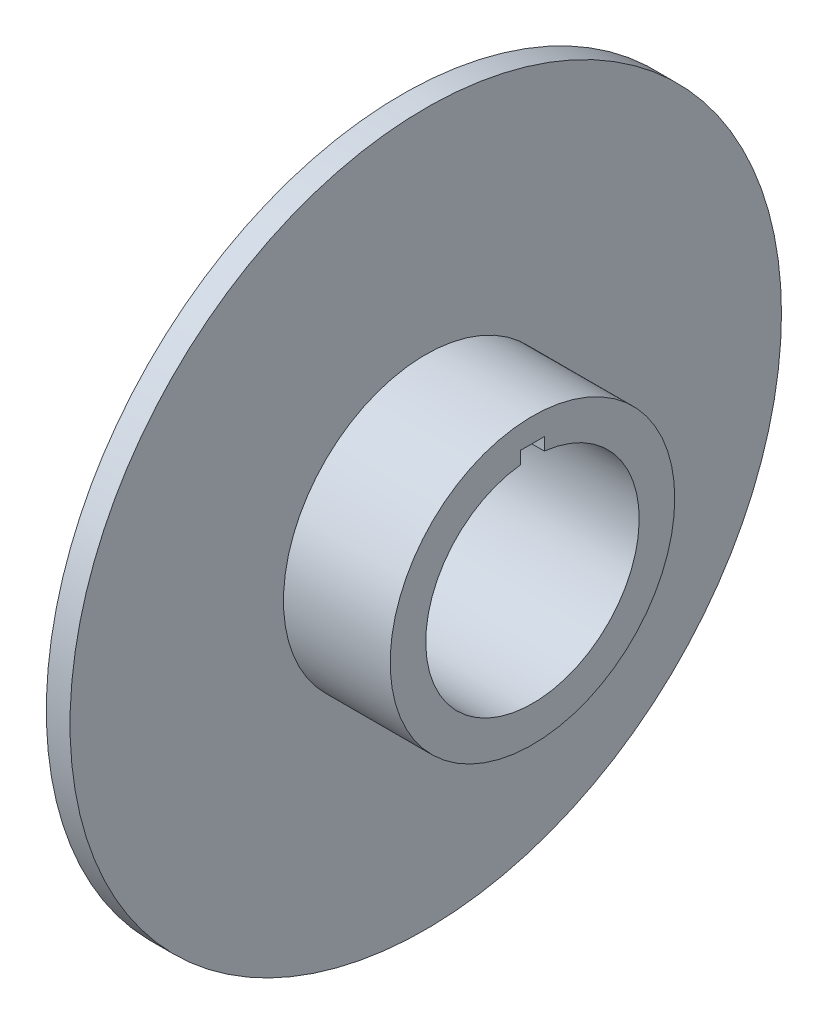
ISO-10303-21;
HEADER;
FILE_DESCRIPTION(('STEP AP214'),'2;1');
FILE_NAME('part.step','',(''),(''),'','','');
FILE_SCHEMA(('AUTOMOTIVE_DESIGN { 1 0 10303 214 1 1 1 1 }'));
ENDSEC;
DATA;
#1=APPLICATION_CONTEXT('core data for automotive mechanical design processes');
#2=APPLICATION_PROTOCOL_DEFINITION('international standard','automotive_design',2000,#1);
#3=PRODUCT_CONTEXT('',#1,'mechanical');
#4=PRODUCT('Part','Part','',(#3));
#5=PRODUCT_RELATED_PRODUCT_CATEGORY('part','',(#4));
#6=PRODUCT_DEFINITION_FORMATION('','',#4);
#7=PRODUCT_DEFINITION_CONTEXT('part definition',#1,'design');
#8=PRODUCT_DEFINITION('design','',#6,#7);
#9=PRODUCT_DEFINITION_SHAPE('','',#8);
#10=(LENGTH_UNIT() NAMED_UNIT(*) SI_UNIT(.MILLI.,.METRE.));
#11=(NAMED_UNIT(*) PLANE_ANGLE_UNIT() SI_UNIT($,.RADIAN.));
#12=(NAMED_UNIT(*) SI_UNIT($,.STERADIAN.) SOLID_ANGLE_UNIT());
#13=UNCERTAINTY_MEASURE_WITH_UNIT(LENGTH_MEASURE(1.E-05),#10,'distance_accuracy_value','');
#14=(GEOMETRIC_REPRESENTATION_CONTEXT(3) GLOBAL_UNCERTAINTY_ASSIGNED_CONTEXT((#13)) GLOBAL_UNIT_ASSIGNED_CONTEXT((#10,
#11,#12)) REPRESENTATION_CONTEXT('',''));
#15=CARTESIAN_POINT('',(0.,0.,0.));
#16=DIRECTION('',(0.,0.,1.));
#17=DIRECTION('',(1.,0.,0.));
#18=AXIS2_PLACEMENT_3D('',#15,#16,#17);
#19=CARTESIAN_POINT('',(50.,0.,0.));
#20=DIRECTION('',(-1.,0.,0.));
#21=DIRECTION('',(0.,0.,1.));
#22=AXIS2_PLACEMENT_3D('',#19,#20,#21);
#23=CYLINDRICAL_SURFACE('',#22,60.);
#24=CARTESIAN_POINT('',(-50.,0.,0.));
#25=DIRECTION('',(1.,0.,0.));
#26=DIRECTION('',(0.,0.,-1.));
#27=AXIS2_PLACEMENT_3D('',#24,#25,#26);
#28=CIRCLE('',#27,60.);
#29=CARTESIAN_POINT('',(-50.,0.,-60.));
#30=VERTEX_POINT('',#29);
#31=EDGE_CURVE('E135',#30,#30,#28,.T.);
#32=ORIENTED_EDGE('',*,*,#31,.T.);
#33=EDGE_LOOP('',(#32));
#34=FACE_BOUND('',#33,.T.);
#35=CARTESIAN_POINT('',(-5.,0.,0.));
#36=DIRECTION('',(1.,0.,0.));
#37=DIRECTION('',(0.,0.,-1.));
#38=AXIS2_PLACEMENT_3D('',#35,#36,#37);
#39=CIRCLE('',#38,60.);
#40=CARTESIAN_POINT('',(-5.,0.,-60.));
#41=VERTEX_POINT('',#40);
#42=EDGE_CURVE('E11',#41,#41,#39,.T.);
#43=ORIENTED_EDGE('',*,*,#42,.F.);
#44=EDGE_LOOP('',(#43));
#45=FACE_BOUND('',#44,.T.);
#46=ADVANCED_FACE('F45',(#34,#45),#23,.T.);
#47=CARTESIAN_POINT('',(50.,0.,0.));
#48=DIRECTION('',(-1.,0.,0.));
#49=DIRECTION('',(0.,0.,1.));
#50=AXIS2_PLACEMENT_3D('',#47,#48,#49);
#51=CYLINDRICAL_SURFACE('',#50,45.);
#52=CARTESIAN_POINT('',(-50.,0.,0.));
#53=DIRECTION('',(1.,0.,0.));
#54=DIRECTION('',(0.,0.,-1.));
#55=AXIS2_PLACEMENT_3D('',#52,#53,#54);
#56=CIRCLE('',#55,45.);
#57=CARTESIAN_POINT('',(-50.,44.7213595499958,5.));
#58=VERTEX_POINT('',#57);
#59=CARTESIAN_POINT('',(-50.,44.7213595499958,-5.));
#60=VERTEX_POINT('',#59);
#61=EDGE_CURVE('E122',#58,#60,#56,.T.);
#62=ORIENTED_EDGE('',*,*,#61,.F.);
#63=DIRECTION('',(-1.,0.,0.));
#64=VECTOR('',#63,1.);
#65=CARTESIAN_POINT('',(50.,44.7213595499958,5.));
#66=LINE('',#65,#64);
#67=CARTESIAN_POINT('',(50.,44.7213595499958,5.));
#68=VERTEX_POINT('',#67);
#69=EDGE_CURVE('E55',#68,#58,#66,.T.);
#70=ORIENTED_EDGE('',*,*,#69,.F.);
#71=CARTESIAN_POINT('',(50.,0.,0.));
#72=DIRECTION('',(1.,0.,0.));
#73=DIRECTION('',(0.,0.,-1.));
#74=AXIS2_PLACEMENT_3D('',#71,#72,#73);
#75=CIRCLE('',#74,45.);
#76=CARTESIAN_POINT('',(50.,44.7213595499958,-5.));
#77=VERTEX_POINT('',#76);
#78=EDGE_CURVE('E97',#68,#77,#75,.T.);
#79=ORIENTED_EDGE('',*,*,#78,.T.);
#80=DIRECTION('',(-1.,0.,0.));
#81=VECTOR('',#80,1.);
#82=CARTESIAN_POINT('',(50.,44.7213595499958,-5.));
#83=LINE('',#82,#81);
#84=EDGE_CURVE('E63',#77,#60,#83,.T.);
#85=ORIENTED_EDGE('',*,*,#84,.T.);
#86=EDGE_LOOP('',(#62,#70,#79,#85));
#87=FACE_BOUND('',#86,.T.);
#88=ADVANCED_FACE('F47',(#87),#51,.F.);
#89=CARTESIAN_POINT('',(50.,0.,5.));
#90=DIRECTION('',(0.,0.,1.));
#91=DIRECTION('',(1.,0.,0.));
#92=AXIS2_PLACEMENT_3D('',#89,#90,#91);
#93=PLANE('',#92);
#94=DIRECTION('',(0.,1.,0.));
#95=VECTOR('',#94,1.);
#96=CARTESIAN_POINT('',(-50.,0.,5.));
#97=LINE('',#96,#95);
#98=CARTESIAN_POINT('',(-50.,50.,5.));
#99=VERTEX_POINT('',#98);
#100=EDGE_CURVE('E105',#58,#99,#97,.T.);
#101=ORIENTED_EDGE('',*,*,#100,.T.);
#102=DIRECTION('',(-1.,0.,0.));
#103=VECTOR('',#102,1.);
#104=CARTESIAN_POINT('',(50.,50.,5.));
#105=LINE('',#104,#103);
#106=CARTESIAN_POINT('',(50.,50.,5.));
#107=VERTEX_POINT('',#106);
#108=EDGE_CURVE('E102',#107,#99,#105,.T.);
#109=ORIENTED_EDGE('',*,*,#108,.F.);
#110=DIRECTION('',(0.,1.,0.));
#111=VECTOR('',#110,1.);
#112=CARTESIAN_POINT('',(50.,0.,5.));
#113=LINE('',#112,#111);
#114=EDGE_CURVE('E90',#68,#107,#113,.T.);
#115=ORIENTED_EDGE('',*,*,#114,.F.);
#116=ORIENTED_EDGE('',*,*,#69,.T.);
#117=EDGE_LOOP('',(#101,#109,#115,#116));
#118=FACE_BOUND('',#117,.T.);
#119=ADVANCED_FACE('F103',(#118),#93,.F.);
#120=CARTESIAN_POINT('',(50.,50.,0.));
#121=DIRECTION('',(0.,1.,0.));
#122=DIRECTION('',(0.,0.,1.));
#123=AXIS2_PLACEMENT_3D('',#120,#121,#122);
#124=PLANE('',#123);
#125=DIRECTION('',(0.,0.,-1.));
#126=VECTOR('',#125,1.);
#127=CARTESIAN_POINT('',(-50.,50.,0.));
#128=LINE('',#127,#126);
#129=CARTESIAN_POINT('',(-50.,50.,-5.));
#130=VERTEX_POINT('',#129);
#131=EDGE_CURVE('E128',#99,#130,#128,.T.);
#132=ORIENTED_EDGE('',*,*,#131,.T.);
#133=DIRECTION('',(-1.,0.,0.));
#134=VECTOR('',#133,1.);
#135=CARTESIAN_POINT('',(50.,50.,-5.));
#136=LINE('',#135,#134);
#137=CARTESIAN_POINT('',(50.,50.,-5.));
#138=VERTEX_POINT('',#137);
#139=EDGE_CURVE('E78',#138,#130,#136,.T.);
#140=ORIENTED_EDGE('',*,*,#139,.F.);
#141=DIRECTION('',(0.,0.,-1.));
#142=VECTOR('',#141,1.);
#143=CARTESIAN_POINT('',(50.,50.,0.));
#144=LINE('',#143,#142);
#145=EDGE_CURVE('E96',#107,#138,#144,.T.);
#146=ORIENTED_EDGE('',*,*,#145,.F.);
#147=ORIENTED_EDGE('',*,*,#108,.T.);
#148=EDGE_LOOP('',(#132,#140,#146,#147));
#149=FACE_BOUND('',#148,.T.);
#150=ADVANCED_FACE('F110',(#149),#124,.F.);
#151=CARTESIAN_POINT('',(50.,0.,-5.));
#152=DIRECTION('',(0.,0.,1.));
#153=DIRECTION('',(1.,0.,0.));
#154=AXIS2_PLACEMENT_3D('',#151,#152,#153);
#155=PLANE('',#154);
#156=DIRECTION('',(0.,1.,0.));
#157=VECTOR('',#156,1.);
#158=CARTESIAN_POINT('',(-50.,0.,-5.));
#159=LINE('',#158,#157);
#160=EDGE_CURVE('E131',#60,#130,#159,.T.);
#161=ORIENTED_EDGE('',*,*,#160,.F.);
#162=ORIENTED_EDGE('',*,*,#84,.F.);
#163=DIRECTION('',(0.,1.,0.));
#164=VECTOR('',#163,1.);
#165=CARTESIAN_POINT('',(50.,0.,-5.));
#166=LINE('',#165,#164);
#167=EDGE_CURVE('E112',#77,#138,#166,.T.);
#168=ORIENTED_EDGE('',*,*,#167,.T.);
#169=ORIENTED_EDGE('',*,*,#139,.T.);
#170=EDGE_LOOP('',(#161,#162,#168,#169));
#171=FACE_BOUND('',#170,.T.);
#172=ADVANCED_FACE('F160',(#171),#155,.T.);
#173=CARTESIAN_POINT('',(5.,0.,0.));
#174=DIRECTION('',(1.,0.,0.));
#175=DIRECTION('',(0.,0.,-1.));
#176=AXIS2_PLACEMENT_3D('',#173,#174,#175);
#177=CIRCLE('',#176,60.);
#178=CARTESIAN_POINT('',(5.,0.,-60.));
#179=VERTEX_POINT('',#178);
#180=EDGE_CURVE('E170',#179,#179,#177,.T.);
#181=ORIENTED_EDGE('',*,*,#180,.T.);
#182=EDGE_LOOP('',(#181));
#183=FACE_BOUND('',#182,.T.);
#184=CARTESIAN_POINT('',(50.,0.,0.));
#185=DIRECTION('',(1.,0.,0.));
#186=DIRECTION('',(0.,0.,-1.));
#187=AXIS2_PLACEMENT_3D('',#184,#185,#186);
#188=CIRCLE('',#187,60.);
#189=CARTESIAN_POINT('',(50.,0.,-60.));
#190=VERTEX_POINT('',#189);
#191=EDGE_CURVE('E115',#190,#190,#188,.T.);
#192=ORIENTED_EDGE('',*,*,#191,.F.);
#193=EDGE_LOOP('',(#192));
#194=FACE_BOUND('',#193,.T.);
#195=ADVANCED_FACE('F153',(#183,#194),#23,.T.);
#196=CARTESIAN_POINT('',(50.,0.,0.));
#197=DIRECTION('',(1.,0.,0.));
#198=DIRECTION('',(0.,0.,-1.));
#199=AXIS2_PLACEMENT_3D('',#196,#197,#198);
#200=PLANE('',#199);
#201=ORIENTED_EDGE('',*,*,#78,.F.);
#202=ORIENTED_EDGE('',*,*,#114,.T.);
#203=ORIENTED_EDGE('',*,*,#145,.T.);
#204=ORIENTED_EDGE('',*,*,#167,.F.);
#205=EDGE_LOOP('',(#201,#202,#203,#204));
#206=FACE_BOUND('',#205,.T.);
#207=ORIENTED_EDGE('',*,*,#191,.T.);
#208=EDGE_LOOP('',(#207));
#209=FACE_BOUND('',#208,.T.);
#210=ADVANCED_FACE('F92',(#206,#209),#200,.T.);
#211=CARTESIAN_POINT('',(-50.,0.,0.));
#212=DIRECTION('',(1.,0.,0.));
#213=DIRECTION('',(0.,0.,-1.));
#214=AXIS2_PLACEMENT_3D('',#211,#212,#213);
#215=PLANE('',#214);
#216=ORIENTED_EDGE('',*,*,#61,.T.);
#217=ORIENTED_EDGE('',*,*,#160,.T.);
#218=ORIENTED_EDGE('',*,*,#131,.F.);
#219=ORIENTED_EDGE('',*,*,#100,.F.);
#220=EDGE_LOOP('',(#216,#217,#218,#219));
#221=FACE_BOUND('',#220,.T.);
#222=ORIENTED_EDGE('',*,*,#31,.F.);
#223=EDGE_LOOP('',(#222));
#224=FACE_BOUND('',#223,.T.);
#225=ADVANCED_FACE('F144',(#221,#224),#215,.F.);
#226=CARTESIAN_POINT('',(5.,0.,0.));
#227=DIRECTION('',(-1.,0.,0.));
#228=DIRECTION('',(0.,0.,1.));
#229=AXIS2_PLACEMENT_3D('',#226,#227,#228);
#230=CYLINDRICAL_SURFACE('',#229,150.);
#231=CARTESIAN_POINT('',(5.,0.,0.));
#232=DIRECTION('',(1.,0.,0.));
#233=DIRECTION('',(0.,0.,-1.));
#234=AXIS2_PLACEMENT_3D('',#231,#232,#233);
#235=CIRCLE('',#234,150.);
#236=CARTESIAN_POINT('',(5.,0.,-150.));
#237=VERTEX_POINT('',#236);
#238=EDGE_CURVE('E125',#237,#237,#235,.T.);
#239=ORIENTED_EDGE('',*,*,#238,.F.);
#240=EDGE_LOOP('',(#239));
#241=FACE_BOUND('',#240,.T.);
#242=CARTESIAN_POINT('',(-5.,0.,0.));
#243=DIRECTION('',(1.,0.,0.));
#244=DIRECTION('',(0.,0.,-1.));
#245=AXIS2_PLACEMENT_3D('',#242,#243,#244);
#246=CIRCLE('',#245,150.);
#247=CARTESIAN_POINT('',(-5.,0.,-150.));
#248=VERTEX_POINT('',#247);
#249=EDGE_CURVE('E174',#248,#248,#246,.T.);
#250=ORIENTED_EDGE('',*,*,#249,.T.);
#251=EDGE_LOOP('',(#250));
#252=FACE_BOUND('',#251,.T.);
#253=ADVANCED_FACE('F185',(#241,#252),#230,.T.);
#254=CARTESIAN_POINT('',(5.,0.,0.));
#255=DIRECTION('',(1.,0.,0.));
#256=DIRECTION('',(0.,0.,-1.));
#257=AXIS2_PLACEMENT_3D('',#254,#255,#256);
#258=PLANE('',#257);
#259=ORIENTED_EDGE('',*,*,#180,.F.);
#260=EDGE_LOOP('',(#259));
#261=FACE_BOUND('',#260,.T.);
#262=ORIENTED_EDGE('',*,*,#238,.T.);
#263=EDGE_LOOP('',(#262));
#264=FACE_BOUND('',#263,.T.);
#265=ADVANCED_FACE('F189',(#261,#264),#258,.T.);
#266=CARTESIAN_POINT('',(-5.,0.,0.));
#267=DIRECTION('',(1.,0.,0.));
#268=DIRECTION('',(0.,0.,-1.));
#269=AXIS2_PLACEMENT_3D('',#266,#267,#268);
#270=PLANE('',#269);
#271=ORIENTED_EDGE('',*,*,#42,.T.);
#272=EDGE_LOOP('',(#271));
#273=FACE_BOUND('',#272,.T.);
#274=ORIENTED_EDGE('',*,*,#249,.F.);
#275=EDGE_LOOP('',(#274));
#276=FACE_BOUND('',#275,.T.);
#277=ADVANCED_FACE('F187',(#273,#276),#270,.F.);
#278=CLOSED_SHELL('',(#46,#88,#119,#150,#172,#195,#210,#225,#253,#265,#277));
#279=MANIFOLD_SOLID_BREP('B2',#278);
#280=ADVANCED_BREP_SHAPE_REPRESENTATION('',(#18,#279),#14);
#281=SHAPE_DEFINITION_REPRESENTATION(#9,#280);
ENDSEC;
END-ISO-10303-21;
